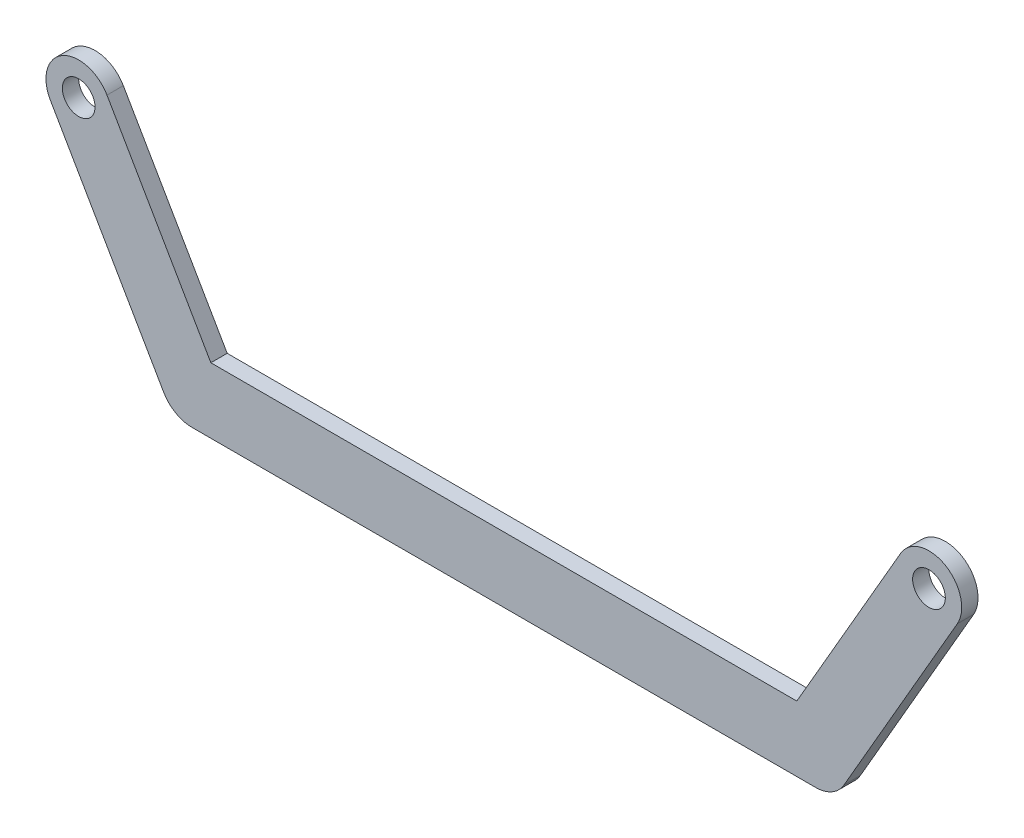
ISO-10303-21;
HEADER;
FILE_DESCRIPTION(('STEP AP214'),'2;1');
FILE_NAME('part.step','',(''),(''),'','','');
FILE_SCHEMA(('AUTOMOTIVE_DESIGN { 1 0 10303 214 1 1 1 1 }'));
ENDSEC;
DATA;
#1=APPLICATION_CONTEXT('core data for automotive mechanical design processes');
#2=APPLICATION_PROTOCOL_DEFINITION('international standard','automotive_design',2000,#1);
#3=PRODUCT_CONTEXT('',#1,'mechanical');
#4=PRODUCT('Part','Part','',(#3));
#5=PRODUCT_RELATED_PRODUCT_CATEGORY('part','',(#4));
#6=PRODUCT_DEFINITION_FORMATION('','',#4);
#7=PRODUCT_DEFINITION_CONTEXT('part definition',#1,'design');
#8=PRODUCT_DEFINITION('design','',#6,#7);
#9=PRODUCT_DEFINITION_SHAPE('','',#8);
#10=(LENGTH_UNIT() NAMED_UNIT(*) SI_UNIT(.MILLI.,.METRE.));
#11=(NAMED_UNIT(*) PLANE_ANGLE_UNIT() SI_UNIT($,.RADIAN.));
#12=(NAMED_UNIT(*) SI_UNIT($,.STERADIAN.) SOLID_ANGLE_UNIT());
#13=UNCERTAINTY_MEASURE_WITH_UNIT(LENGTH_MEASURE(1.E-05),#10,'distance_accuracy_value','');
#14=(GEOMETRIC_REPRESENTATION_CONTEXT(3) GLOBAL_UNCERTAINTY_ASSIGNED_CONTEXT((#13)) GLOBAL_UNIT_ASSIGNED_CONTEXT((#10,
#11,#12)) REPRESENTATION_CONTEXT('',''));
#15=CARTESIAN_POINT('',(0.,0.,0.));
#16=DIRECTION('',(0.,0.,1.));
#17=DIRECTION('',(1.,0.,0.));
#18=AXIS2_PLACEMENT_3D('',#15,#16,#17);
#19=CARTESIAN_POINT('',(-509.139773719373,-293.951985412029,-31.75));
#20=DIRECTION('',(0.866025403784436,0.500000000000004,0.));
#21=DIRECTION('',(-0.500000000000004,0.866025403784436,0.));
#22=AXIS2_PLACEMENT_3D('',#19,#20,#21);
#23=PLANE('',#22);
#24=DIRECTION('',(-0.500000000000004,0.866025403784436,0.));
#25=VECTOR('',#24,1.);
#26=CARTESIAN_POINT('',(-509.139773719373,-293.951985412029,0.));
#27=LINE('',#26,#25);
#28=CARTESIAN_POINT('',(-660.522160579064,-31.7500000000002,0.));
#29=VERTEX_POINT('',#28);
#30=CARTESIAN_POINT('',(-880.492613140314,349.25,0.));
#31=VERTEX_POINT('',#30);
#32=EDGE_CURVE('E143',#29,#31,#27,.T.);
#33=ORIENTED_EDGE('',*,*,#32,.T.);
#34=DIRECTION('',(0.,0.,1.));
#35=VECTOR('',#34,1.);
#36=CARTESIAN_POINT('',(-880.492613140314,349.25,-31.75));
#37=LINE('',#36,#35);
#38=CARTESIAN_POINT('',(-880.492613140314,349.25,-31.75));
#39=VERTEX_POINT('',#38);
#40=EDGE_CURVE('E11',#39,#31,#37,.T.);
#41=ORIENTED_EDGE('',*,*,#40,.F.);
#42=DIRECTION('',(-0.500000000000004,0.866025403784436,0.));
#43=VECTOR('',#42,1.);
#44=CARTESIAN_POINT('',(-509.139773719373,-293.951985412029,-31.75));
#45=LINE('',#44,#43);
#46=CARTESIAN_POINT('',(-660.522160579064,-31.7500000000002,-31.75));
#47=VERTEX_POINT('',#46);
#48=EDGE_CURVE('E55',#47,#39,#45,.T.);
#49=ORIENTED_EDGE('',*,*,#48,.F.);
#50=DIRECTION('',(0.,0.,1.));
#51=VECTOR('',#50,1.);
#52=CARTESIAN_POINT('',(-660.522160579064,-31.7500000000002,-31.75));
#53=LINE('',#52,#51);
#54=EDGE_CURVE('E40',#47,#29,#53,.T.);
#55=ORIENTED_EDGE('',*,*,#54,.T.);
#56=EDGE_LOOP('',(#33,#41,#49,#55));
#57=FACE_BOUND('',#56,.T.);
#58=ADVANCED_FACE('F37',(#57),#23,.F.);
#59=CARTESIAN_POINT('',(-825.500000000002,381.,-31.75));
#60=DIRECTION('',(0.,0.,1.));
#61=DIRECTION('',(1.,0.,0.));
#62=AXIS2_PLACEMENT_3D('',#59,#60,#61);
#63=CYLINDRICAL_SURFACE('',#62,63.5000000000001);
#64=CARTESIAN_POINT('',(-825.500000000002,381.,0.));
#65=DIRECTION('',(0.,0.,1.));
#66=DIRECTION('',(1.,0.,0.));
#67=AXIS2_PLACEMENT_3D('',#64,#65,#66);
#68=CIRCLE('',#67,63.5000000000001);
#69=CARTESIAN_POINT('',(-770.50738685969,412.75,0.));
#70=VERTEX_POINT('',#69);
#71=EDGE_CURVE('E167',#70,#31,#68,.T.);
#72=ORIENTED_EDGE('',*,*,#71,.F.);
#73=DIRECTION('',(0.,0.,1.));
#74=VECTOR('',#73,1.);
#75=CARTESIAN_POINT('',(-770.50738685969,412.75,-31.75));
#76=LINE('',#75,#74);
#77=CARTESIAN_POINT('',(-770.50738685969,412.75,-31.75));
#78=VERTEX_POINT('',#77);
#79=EDGE_CURVE('E46',#78,#70,#76,.T.);
#80=ORIENTED_EDGE('',*,*,#79,.F.);
#81=CARTESIAN_POINT('',(-825.500000000002,381.,-31.75));
#82=DIRECTION('',(0.,0.,1.));
#83=DIRECTION('',(1.,0.,0.));
#84=AXIS2_PLACEMENT_3D('',#81,#82,#83);
#85=CIRCLE('',#84,63.5000000000001);
#86=EDGE_CURVE('E138',#78,#39,#85,.T.);
#87=ORIENTED_EDGE('',*,*,#86,.T.);
#88=ORIENTED_EDGE('',*,*,#40,.T.);
#89=EDGE_LOOP('',(#72,#80,#87,#88));
#90=FACE_BOUND('',#89,.T.);
#91=ADVANCED_FACE('F198',(#90),#63,.T.);
#92=CARTESIAN_POINT('',(-399.15454743875,-230.451985412028,-31.75));
#93=DIRECTION('',(0.866025403784436,0.500000000000004,0.));
#94=DIRECTION('',(-0.500000000000004,0.866025403784437,0.));
#95=AXIS2_PLACEMENT_3D('',#92,#93,#94);
#96=PLANE('',#95);
#97=DIRECTION('',(-0.500000000000004,0.866025403784437,0.));
#98=VECTOR('',#97,1.);
#99=CARTESIAN_POINT('',(-399.15454743875,-230.451985412028,0.));
#100=LINE('',#99,#98);
#101=CARTESIAN_POINT('',(-568.867805345211,63.5,0.));
#102=VERTEX_POINT('',#101);
#103=EDGE_CURVE('E125',#102,#70,#100,.T.);
#104=ORIENTED_EDGE('',*,*,#103,.F.);
#105=DIRECTION('',(0.,0.,1.));
#106=VECTOR('',#105,1.);
#107=CARTESIAN_POINT('',(-568.867805345211,63.5,-31.75));
#108=LINE('',#107,#106);
#109=CARTESIAN_POINT('',(-568.867805345211,63.5,-31.75));
#110=VERTEX_POINT('',#109);
#111=EDGE_CURVE('E120',#110,#102,#108,.T.);
#112=ORIENTED_EDGE('',*,*,#111,.F.);
#113=DIRECTION('',(-0.500000000000004,0.866025403784437,0.));
#114=VECTOR('',#113,1.);
#115=CARTESIAN_POINT('',(-399.15454743875,-230.451985412028,-31.75));
#116=LINE('',#115,#114);
#117=EDGE_CURVE('E124',#110,#78,#116,.T.);
#118=ORIENTED_EDGE('',*,*,#117,.T.);
#119=ORIENTED_EDGE('',*,*,#79,.T.);
#120=EDGE_LOOP('',(#104,#112,#118,#119));
#121=FACE_BOUND('',#120,.T.);
#122=ADVANCED_FACE('F122',(#121),#96,.T.);
#123=CARTESIAN_POINT('',(0.,63.5,-31.75));
#124=DIRECTION('',(0.,-1.,0.));
#125=DIRECTION('',(0.,0.,-1.));
#126=AXIS2_PLACEMENT_3D('',#123,#124,#125);
#127=PLANE('',#126);
#128=DIRECTION('',(1.,0.,0.));
#129=VECTOR('',#128,1.);
#130=CARTESIAN_POINT('',(0.,63.5,0.));
#131=LINE('',#130,#129);
#132=CARTESIAN_POINT('',(568.867805345211,63.5,0.));
#133=VERTEX_POINT('',#132);
#134=EDGE_CURVE('E164',#102,#133,#131,.T.);
#135=ORIENTED_EDGE('',*,*,#134,.T.);
#136=DIRECTION('',(0.,0.,1.));
#137=VECTOR('',#136,1.);
#138=CARTESIAN_POINT('',(568.867805345211,63.5,-31.75));
#139=LINE('',#138,#137);
#140=CARTESIAN_POINT('',(568.867805345211,63.5,-31.75));
#141=VERTEX_POINT('',#140);
#142=EDGE_CURVE('E128',#141,#133,#139,.T.);
#143=ORIENTED_EDGE('',*,*,#142,.F.);
#144=DIRECTION('',(1.,0.,0.));
#145=VECTOR('',#144,1.);
#146=CARTESIAN_POINT('',(0.,63.5,-31.75));
#147=LINE('',#146,#145);
#148=EDGE_CURVE('E131',#110,#141,#147,.T.);
#149=ORIENTED_EDGE('',*,*,#148,.F.);
#150=ORIENTED_EDGE('',*,*,#111,.T.);
#151=EDGE_LOOP('',(#135,#143,#149,#150));
#152=FACE_BOUND('',#151,.T.);
#153=ADVANCED_FACE('F132',(#152),#127,.F.);
#154=CARTESIAN_POINT('',(399.154547438753,-230.451985412026,-31.75));
#155=DIRECTION('',(0.86602540378444,-0.499999999999998,0.));
#156=DIRECTION('',(0.499999999999998,0.86602540378444,0.));
#157=AXIS2_PLACEMENT_3D('',#154,#155,#156);
#158=PLANE('',#157);
#159=DIRECTION('',(0.499999999999998,0.86602540378444,0.));
#160=VECTOR('',#159,1.);
#161=CARTESIAN_POINT('',(399.154547438753,-230.451985412026,0.));
#162=LINE('',#161,#160);
#163=CARTESIAN_POINT('',(770.507386859686,412.75,0.));
#164=VERTEX_POINT('',#163);
#165=EDGE_CURVE('E161',#133,#164,#162,.T.);
#166=ORIENTED_EDGE('',*,*,#165,.T.);
#167=DIRECTION('',(0.,0.,1.));
#168=VECTOR('',#167,1.);
#169=CARTESIAN_POINT('',(770.507386859686,412.75,-31.75));
#170=LINE('',#169,#168);
#171=CARTESIAN_POINT('',(770.507386859686,412.75,-31.75));
#172=VERTEX_POINT('',#171);
#173=EDGE_CURVE('E172',#172,#164,#170,.T.);
#174=ORIENTED_EDGE('',*,*,#173,.F.);
#175=DIRECTION('',(0.499999999999998,0.86602540378444,0.));
#176=VECTOR('',#175,1.);
#177=CARTESIAN_POINT('',(399.154547438753,-230.451985412026,-31.75));
#178=LINE('',#177,#176);
#179=EDGE_CURVE('E135',#141,#172,#178,.T.);
#180=ORIENTED_EDGE('',*,*,#179,.F.);
#181=ORIENTED_EDGE('',*,*,#142,.T.);
#182=EDGE_LOOP('',(#166,#174,#180,#181));
#183=FACE_BOUND('',#182,.T.);
#184=ADVANCED_FACE('F211',(#183),#158,.F.);
#185=CARTESIAN_POINT('',(825.499999999998,381.,-31.75));
#186=DIRECTION('',(0.,0.,1.));
#187=DIRECTION('',(1.,0.,0.));
#188=AXIS2_PLACEMENT_3D('',#185,#186,#187);
#189=CYLINDRICAL_SURFACE('',#188,63.4999999999998);
#190=CARTESIAN_POINT('',(825.499999999998,381.,0.));
#191=DIRECTION('',(0.,0.,1.));
#192=DIRECTION('',(1.,0.,0.));
#193=AXIS2_PLACEMENT_3D('',#190,#191,#192);
#194=CIRCLE('',#193,63.4999999999998);
#195=CARTESIAN_POINT('',(880.49261314031,349.25,0.));
#196=VERTEX_POINT('',#195);
#197=EDGE_CURVE('E158',#196,#164,#194,.T.);
#198=ORIENTED_EDGE('',*,*,#197,.F.);
#199=DIRECTION('',(0.,0.,1.));
#200=VECTOR('',#199,1.);
#201=CARTESIAN_POINT('',(880.49261314031,349.25,-31.75));
#202=LINE('',#201,#200);
#203=CARTESIAN_POINT('',(880.49261314031,349.25,-31.75));
#204=VERTEX_POINT('',#203);
#205=EDGE_CURVE('E174',#204,#196,#202,.T.);
#206=ORIENTED_EDGE('',*,*,#205,.F.);
#207=CARTESIAN_POINT('',(825.499999999998,381.,-31.75));
#208=DIRECTION('',(0.,0.,1.));
#209=DIRECTION('',(1.,0.,0.));
#210=AXIS2_PLACEMENT_3D('',#207,#208,#209);
#211=CIRCLE('',#210,63.4999999999998);
#212=EDGE_CURVE('E244',#204,#172,#211,.T.);
#213=ORIENTED_EDGE('',*,*,#212,.T.);
#214=ORIENTED_EDGE('',*,*,#173,.T.);
#215=EDGE_LOOP('',(#198,#206,#213,#214));
#216=FACE_BOUND('',#215,.T.);
#217=ADVANCED_FACE('F214',(#216),#189,.T.);
#218=CARTESIAN_POINT('',(509.139773719377,-293.951985412026,-31.75));
#219=DIRECTION('',(0.86602540378444,-0.499999999999998,0.));
#220=DIRECTION('',(0.499999999999998,0.86602540378444,0.));
#221=AXIS2_PLACEMENT_3D('',#218,#219,#220);
#222=PLANE('',#221);
#223=DIRECTION('',(0.499999999999998,0.86602540378444,0.));
#224=VECTOR('',#223,1.);
#225=CARTESIAN_POINT('',(509.139773719377,-293.951985412026,0.));
#226=LINE('',#225,#224);
#227=CARTESIAN_POINT('',(660.522160579064,-31.7499999999998,0.));
#228=VERTEX_POINT('',#227);
#229=EDGE_CURVE('E155',#228,#196,#226,.T.);
#230=ORIENTED_EDGE('',*,*,#229,.F.);
#231=DIRECTION('',(0.,0.,1.));
#232=VECTOR('',#231,1.);
#233=CARTESIAN_POINT('',(660.522160579064,-31.7499999999998,-31.75));
#234=LINE('',#233,#232);
#235=CARTESIAN_POINT('',(660.522160579064,-31.7499999999998,-31.75));
#236=VERTEX_POINT('',#235);
#237=EDGE_CURVE('E176',#236,#228,#234,.T.);
#238=ORIENTED_EDGE('',*,*,#237,.F.);
#239=DIRECTION('',(0.499999999999998,0.86602540378444,0.));
#240=VECTOR('',#239,1.);
#241=CARTESIAN_POINT('',(509.139773719377,-293.951985412026,-31.75));
#242=LINE('',#241,#240);
#243=EDGE_CURVE('E237',#236,#204,#242,.T.);
#244=ORIENTED_EDGE('',*,*,#243,.T.);
#245=ORIENTED_EDGE('',*,*,#205,.T.);
#246=EDGE_LOOP('',(#230,#238,#244,#245));
#247=FACE_BOUND('',#246,.T.);
#248=ADVANCED_FACE('F218',(#247),#222,.T.);
#249=CARTESIAN_POINT('',(605.529547438752,0.,-31.75));
#250=DIRECTION('',(0.,0.,1.));
#251=DIRECTION('',(1.,0.,0.));
#252=AXIS2_PLACEMENT_3D('',#249,#250,#251);
#253=CYLINDRICAL_SURFACE('',#252,63.4999999999999);
#254=CARTESIAN_POINT('',(605.529547438752,0.,0.));
#255=DIRECTION('',(0.,0.,1.));
#256=DIRECTION('',(1.,0.,0.));
#257=AXIS2_PLACEMENT_3D('',#254,#255,#256);
#258=CIRCLE('',#257,63.4999999999999);
#259=CARTESIAN_POINT('',(605.529547438752,-63.4999999999999,0.));
#260=VERTEX_POINT('',#259);
#261=EDGE_CURVE('E152',#260,#228,#258,.T.);
#262=ORIENTED_EDGE('',*,*,#261,.F.);
#263=DIRECTION('',(0.,0.,1.));
#264=VECTOR('',#263,1.);
#265=CARTESIAN_POINT('',(605.529547438752,-63.4999999999999,-31.75));
#266=LINE('',#265,#264);
#267=CARTESIAN_POINT('',(605.529547438752,-63.4999999999999,-31.75));
#268=VERTEX_POINT('',#267);
#269=EDGE_CURVE('E178',#268,#260,#266,.T.);
#270=ORIENTED_EDGE('',*,*,#269,.F.);
#271=CARTESIAN_POINT('',(605.529547438752,0.,-31.75));
#272=DIRECTION('',(0.,0.,1.));
#273=DIRECTION('',(1.,0.,0.));
#274=AXIS2_PLACEMENT_3D('',#271,#272,#273);
#275=CIRCLE('',#274,63.4999999999999);
#276=EDGE_CURVE('E234',#268,#236,#275,.T.);
#277=ORIENTED_EDGE('',*,*,#276,.T.);
#278=ORIENTED_EDGE('',*,*,#237,.T.);
#279=EDGE_LOOP('',(#262,#270,#277,#278));
#280=FACE_BOUND('',#279,.T.);
#281=ADVANCED_FACE('F194',(#280),#253,.T.);
#282=CARTESIAN_POINT('',(0.,-63.5,-31.75));
#283=DIRECTION('',(0.,-1.,0.));
#284=DIRECTION('',(0.,0.,-1.));
#285=AXIS2_PLACEMENT_3D('',#282,#283,#284);
#286=PLANE('',#285);
#287=DIRECTION('',(1.,0.,0.));
#288=VECTOR('',#287,1.);
#289=CARTESIAN_POINT('',(0.,-63.5,0.));
#290=LINE('',#289,#288);
#291=CARTESIAN_POINT('',(-605.529547438752,-63.5,0.));
#292=VERTEX_POINT('',#291);
#293=EDGE_CURVE('E149',#292,#260,#290,.T.);
#294=ORIENTED_EDGE('',*,*,#293,.F.);
#295=DIRECTION('',(0.,0.,1.));
#296=VECTOR('',#295,1.);
#297=CARTESIAN_POINT('',(-605.529547438752,-63.5,-31.75));
#298=LINE('',#297,#296);
#299=CARTESIAN_POINT('',(-605.529547438752,-63.5,-31.75));
#300=VERTEX_POINT('',#299);
#301=EDGE_CURVE('E179',#300,#292,#298,.T.);
#302=ORIENTED_EDGE('',*,*,#301,.F.);
#303=DIRECTION('',(1.,0.,0.));
#304=VECTOR('',#303,1.);
#305=CARTESIAN_POINT('',(0.,-63.5,-31.75));
#306=LINE('',#305,#304);
#307=EDGE_CURVE('E233',#300,#268,#306,.T.);
#308=ORIENTED_EDGE('',*,*,#307,.T.);
#309=ORIENTED_EDGE('',*,*,#269,.T.);
#310=EDGE_LOOP('',(#294,#302,#308,#309));
#311=FACE_BOUND('',#310,.T.);
#312=ADVANCED_FACE('F187',(#311),#286,.T.);
#313=CARTESIAN_POINT('',(-605.529547438752,0.,-31.75));
#314=DIRECTION('',(0.,0.,1.));
#315=DIRECTION('',(1.,0.,0.));
#316=AXIS2_PLACEMENT_3D('',#313,#314,#315);
#317=CYLINDRICAL_SURFACE('',#316,63.5);
#318=CARTESIAN_POINT('',(-605.529547438752,0.,0.));
#319=DIRECTION('',(0.,0.,1.));
#320=DIRECTION('',(1.,0.,0.));
#321=AXIS2_PLACEMENT_3D('',#318,#319,#320);
#322=CIRCLE('',#321,63.5);
#323=EDGE_CURVE('E145',#29,#292,#322,.T.);
#324=ORIENTED_EDGE('',*,*,#323,.F.);
#325=ORIENTED_EDGE('',*,*,#54,.F.);
#326=CARTESIAN_POINT('',(-605.529547438752,0.,-31.75));
#327=DIRECTION('',(0.,0.,1.));
#328=DIRECTION('',(1.,0.,0.));
#329=AXIS2_PLACEMENT_3D('',#326,#327,#328);
#330=CIRCLE('',#329,63.5);
#331=EDGE_CURVE('E235',#47,#300,#330,.T.);
#332=ORIENTED_EDGE('',*,*,#331,.T.);
#333=ORIENTED_EDGE('',*,*,#301,.T.);
#334=EDGE_LOOP('',(#324,#325,#332,#333));
#335=FACE_BOUND('',#334,.T.);
#336=ADVANCED_FACE('F185',(#335),#317,.T.);
#337=CARTESIAN_POINT('',(0.,0.,-31.75));
#338=DIRECTION('',(0.,0.,1.));
#339=DIRECTION('',(1.,0.,0.));
#340=AXIS2_PLACEMENT_3D('',#337,#338,#339);
#341=PLANE('',#340);
#342=CARTESIAN_POINT('',(825.499999999998,381.,-31.75));
#343=DIRECTION('',(0.,0.,1.));
#344=DIRECTION('',(1.,0.,0.));
#345=AXIS2_PLACEMENT_3D('',#342,#343,#344);
#346=CIRCLE('',#345,31.7499999999999);
#347=CARTESIAN_POINT('',(857.249999999998,381.,-31.75));
#348=VERTEX_POINT('',#347);
#349=EDGE_CURVE('E146',#348,#348,#346,.T.);
#350=ORIENTED_EDGE('',*,*,#349,.T.);
#351=EDGE_LOOP('',(#350));
#352=FACE_BOUND('',#351,.T.);
#353=CARTESIAN_POINT('',(-825.500000000002,381.,-31.75));
#354=DIRECTION('',(0.,0.,1.));
#355=DIRECTION('',(1.,0.,0.));
#356=AXIS2_PLACEMENT_3D('',#353,#354,#355);
#357=CIRCLE('',#356,31.7499999999999);
#358=CARTESIAN_POINT('',(-793.750000000002,381.,-31.75));
#359=VERTEX_POINT('',#358);
#360=EDGE_CURVE('E255',#359,#359,#357,.T.);
#361=ORIENTED_EDGE('',*,*,#360,.T.);
#362=EDGE_LOOP('',(#361));
#363=FACE_BOUND('',#362,.T.);
#364=ORIENTED_EDGE('',*,*,#48,.T.);
#365=ORIENTED_EDGE('',*,*,#86,.F.);
#366=ORIENTED_EDGE('',*,*,#117,.F.);
#367=ORIENTED_EDGE('',*,*,#148,.T.);
#368=ORIENTED_EDGE('',*,*,#179,.T.);
#369=ORIENTED_EDGE('',*,*,#212,.F.);
#370=ORIENTED_EDGE('',*,*,#243,.F.);
#371=ORIENTED_EDGE('',*,*,#276,.F.);
#372=ORIENTED_EDGE('',*,*,#307,.F.);
#373=ORIENTED_EDGE('',*,*,#331,.F.);
#374=EDGE_LOOP('',(#364,#365,#366,#367,#368,#369,#370,#371,#372,#373));
#375=FACE_BOUND('',#374,.T.);
#376=ADVANCED_FACE('F137',(#352,#363,#375),#341,.F.);
#377=CARTESIAN_POINT('',(0.,0.,0.));
#378=DIRECTION('',(0.,0.,1.));
#379=DIRECTION('',(1.,0.,0.));
#380=AXIS2_PLACEMENT_3D('',#377,#378,#379);
#381=PLANE('',#380);
#382=CARTESIAN_POINT('',(825.499999999998,381.,0.));
#383=DIRECTION('',(0.,0.,1.));
#384=DIRECTION('',(1.,0.,0.));
#385=AXIS2_PLACEMENT_3D('',#382,#383,#384);
#386=CIRCLE('',#385,31.7499999999999);
#387=CARTESIAN_POINT('',(857.249999999998,381.,0.));
#388=VERTEX_POINT('',#387);
#389=EDGE_CURVE('E258',#388,#388,#386,.T.);
#390=ORIENTED_EDGE('',*,*,#389,.F.);
#391=EDGE_LOOP('',(#390));
#392=FACE_BOUND('',#391,.T.);
#393=CARTESIAN_POINT('',(-825.500000000002,381.,0.));
#394=DIRECTION('',(0.,0.,1.));
#395=DIRECTION('',(1.,0.,0.));
#396=AXIS2_PLACEMENT_3D('',#393,#394,#395);
#397=CIRCLE('',#396,31.7499999999999);
#398=CARTESIAN_POINT('',(-793.750000000002,381.,0.));
#399=VERTEX_POINT('',#398);
#400=EDGE_CURVE('E252',#399,#399,#397,.T.);
#401=ORIENTED_EDGE('',*,*,#400,.F.);
#402=EDGE_LOOP('',(#401));
#403=FACE_BOUND('',#402,.T.);
#404=ORIENTED_EDGE('',*,*,#32,.F.);
#405=ORIENTED_EDGE('',*,*,#323,.T.);
#406=ORIENTED_EDGE('',*,*,#293,.T.);
#407=ORIENTED_EDGE('',*,*,#261,.T.);
#408=ORIENTED_EDGE('',*,*,#229,.T.);
#409=ORIENTED_EDGE('',*,*,#197,.T.);
#410=ORIENTED_EDGE('',*,*,#165,.F.);
#411=ORIENTED_EDGE('',*,*,#134,.F.);
#412=ORIENTED_EDGE('',*,*,#103,.T.);
#413=ORIENTED_EDGE('',*,*,#71,.T.);
#414=EDGE_LOOP('',(#404,#405,#406,#407,#408,#409,#410,#411,#412,#413));
#415=FACE_BOUND('',#414,.T.);
#416=ADVANCED_FACE('F184',(#392,#403,#415),#381,.T.);
#417=CARTESIAN_POINT('',(-825.500000000002,381.,-31.75));
#418=DIRECTION('',(0.,0.,1.));
#419=DIRECTION('',(1.,0.,0.));
#420=AXIS2_PLACEMENT_3D('',#417,#418,#419);
#421=CYLINDRICAL_SURFACE('',#420,31.7499999999999);
#422=ORIENTED_EDGE('',*,*,#360,.F.);
#423=EDGE_LOOP('',(#422));
#424=FACE_BOUND('',#423,.T.);
#425=ORIENTED_EDGE('',*,*,#400,.T.);
#426=EDGE_LOOP('',(#425));
#427=FACE_BOUND('',#426,.T.);
#428=ADVANCED_FACE('F268',(#424,#427),#421,.F.);
#429=CARTESIAN_POINT('',(825.499999999998,381.,-31.75));
#430=DIRECTION('',(0.,0.,1.));
#431=DIRECTION('',(1.,0.,0.));
#432=AXIS2_PLACEMENT_3D('',#429,#430,#431);
#433=CYLINDRICAL_SURFACE('',#432,31.7499999999999);
#434=ORIENTED_EDGE('',*,*,#349,.F.);
#435=EDGE_LOOP('',(#434));
#436=FACE_BOUND('',#435,.T.);
#437=ORIENTED_EDGE('',*,*,#389,.T.);
#438=EDGE_LOOP('',(#437));
#439=FACE_BOUND('',#438,.T.);
#440=ADVANCED_FACE('F265',(#436,#439),#433,.F.);
#441=CLOSED_SHELL('',(#58,#91,#122,#153,#184,#217,#248,#281,#312,#336,#376,#416,#428,#440));
#442=MANIFOLD_SOLID_BREP('B2',#441);
#443=ADVANCED_BREP_SHAPE_REPRESENTATION('',(#18,#442),#14);
#444=SHAPE_DEFINITION_REPRESENTATION(#9,#443);
ENDSEC;
END-ISO-10303-21;
